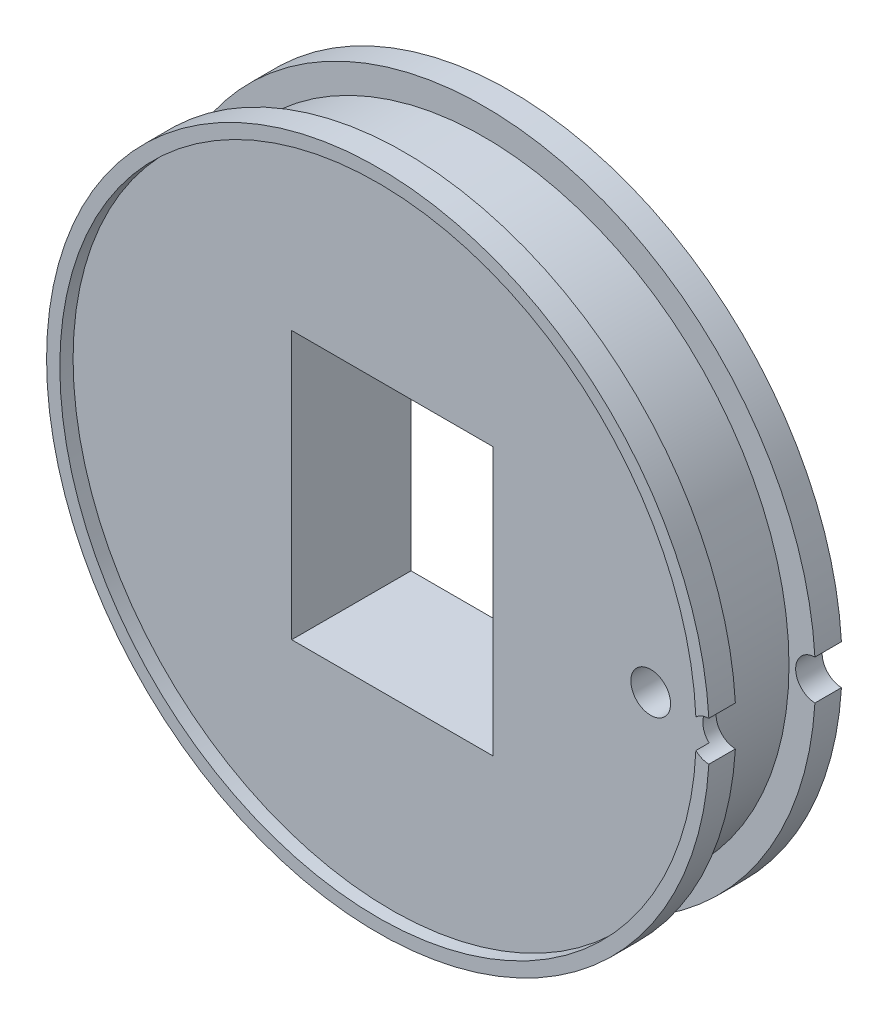
ISO-10303-21;
HEADER;
FILE_DESCRIPTION(('STEP AP214'),'2;1');
FILE_NAME('part.step','',(''),(''),'','','');
FILE_SCHEMA(('AUTOMOTIVE_DESIGN { 1 0 10303 214 1 1 1 1 }'));
ENDSEC;
DATA;
#1=APPLICATION_CONTEXT('core data for automotive mechanical design processes');
#2=APPLICATION_PROTOCOL_DEFINITION('international standard','automotive_design',2000,#1);
#3=PRODUCT_CONTEXT('',#1,'mechanical');
#4=PRODUCT('Part','Part','',(#3));
#5=PRODUCT_RELATED_PRODUCT_CATEGORY('part','',(#4));
#6=PRODUCT_DEFINITION_FORMATION('','',#4);
#7=PRODUCT_DEFINITION_CONTEXT('part definition',#1,'design');
#8=PRODUCT_DEFINITION('design','',#6,#7);
#9=PRODUCT_DEFINITION_SHAPE('','',#8);
#10=(LENGTH_UNIT() NAMED_UNIT(*) SI_UNIT(.MILLI.,.METRE.));
#11=(NAMED_UNIT(*) PLANE_ANGLE_UNIT() SI_UNIT($,.RADIAN.));
#12=(NAMED_UNIT(*) SI_UNIT($,.STERADIAN.) SOLID_ANGLE_UNIT());
#13=UNCERTAINTY_MEASURE_WITH_UNIT(LENGTH_MEASURE(1.E-05),#10,'distance_accuracy_value','');
#14=(GEOMETRIC_REPRESENTATION_CONTEXT(3) GLOBAL_UNCERTAINTY_ASSIGNED_CONTEXT((#13)) GLOBAL_UNIT_ASSIGNED_CONTEXT((#10,
#11,#12)) REPRESENTATION_CONTEXT('',''));
#15=CARTESIAN_POINT('',(0.,0.,0.));
#16=DIRECTION('',(0.,0.,1.));
#17=DIRECTION('',(1.,0.,0.));
#18=AXIS2_PLACEMENT_3D('',#15,#16,#17);
#19=CARTESIAN_POINT('',(0.,0.,9.));
#20=DIRECTION('',(0.,0.,-1.));
#21=DIRECTION('',(-1.,0.,0.));
#22=AXIS2_PLACEMENT_3D('',#19,#20,#21);
#23=CYLINDRICAL_SURFACE('',#22,25.);
#24=CARTESIAN_POINT('',(0.,0.,8.));
#25=DIRECTION('',(0.,0.,-1.));
#26=DIRECTION('',(-1.,0.,0.));
#27=AXIS2_PLACEMENT_3D('',#24,#25,#26);
#28=CIRCLE('',#27,25.);
#29=CARTESIAN_POINT('',(24.955,-1.49932484805663,8.));
#30=VERTEX_POINT('',#29);
#31=CARTESIAN_POINT('',(24.955,1.49932484805663,8.));
#32=VERTEX_POINT('',#31);
#33=EDGE_CURVE('E184',#30,#32,#28,.T.);
#34=ORIENTED_EDGE('',*,*,#33,.F.);
#35=DIRECTION('',(0.,0.,-1.));
#36=VECTOR('',#35,1.);
#37=CARTESIAN_POINT('',(24.955,-1.49932484805662,5.));
#38=LINE('',#37,#36);
#39=CARTESIAN_POINT('',(24.955,-1.49932484805662,10.));
#40=VERTEX_POINT('',#39);
#41=EDGE_CURVE('E58',#30,#40,#38,.F.);
#42=ORIENTED_EDGE('',*,*,#41,.T.);
#43=CARTESIAN_POINT('',(0.,0.,10.));
#44=DIRECTION('',(0.,0.,1.));
#45=DIRECTION('',(1.,0.,0.));
#46=AXIS2_PLACEMENT_3D('',#43,#44,#45);
#47=CIRCLE('',#46,25.);
#48=CARTESIAN_POINT('',(24.955,1.49932484805662,10.));
#49=VERTEX_POINT('',#48);
#50=EDGE_CURVE('E145',#49,#40,#47,.T.);
#51=ORIENTED_EDGE('',*,*,#50,.F.);
#52=DIRECTION('',(0.,0.,-1.));
#53=VECTOR('',#52,1.);
#54=CARTESIAN_POINT('',(24.955,1.49932484805662,5.));
#55=LINE('',#54,#53);
#56=EDGE_CURVE('E123',#49,#32,#55,.T.);
#57=ORIENTED_EDGE('',*,*,#56,.T.);
#58=EDGE_LOOP('',(#34,#42,#51,#57));
#59=FACE_BOUND('',#58,.T.);
#60=ADVANCED_FACE('F42',(#59),#23,.T.);
#61=CARTESIAN_POINT('',(0.,0.,0.));
#62=DIRECTION('',(0.,0.,1.));
#63=DIRECTION('',(1.,0.,0.));
#64=AXIS2_PLACEMENT_3D('',#61,#62,#63);
#65=CIRCLE('',#64,25.);
#66=CARTESIAN_POINT('',(24.955,1.49932484805662,0.));
#67=VERTEX_POINT('',#66);
#68=CARTESIAN_POINT('',(24.955,-1.49932484805662,0.));
#69=VERTEX_POINT('',#68);
#70=EDGE_CURVE('E150',#67,#69,#65,.T.);
#71=ORIENTED_EDGE('',*,*,#70,.T.);
#72=DIRECTION('',(0.,0.,-1.));
#73=VECTOR('',#72,1.);
#74=CARTESIAN_POINT('',(24.955,-1.49932484805662,5.));
#75=LINE('',#74,#73);
#76=CARTESIAN_POINT('',(24.955,-1.49932484805663,2.));
#77=VERTEX_POINT('',#76);
#78=EDGE_CURVE('E256',#69,#77,#75,.F.);
#79=ORIENTED_EDGE('',*,*,#78,.T.);
#80=CARTESIAN_POINT('',(0.,0.,2.));
#81=DIRECTION('',(0.,0.,-1.));
#82=DIRECTION('',(-1.,0.,0.));
#83=AXIS2_PLACEMENT_3D('',#80,#81,#82);
#84=CIRCLE('',#83,25.);
#85=CARTESIAN_POINT('',(24.955,1.49932484805663,2.));
#86=VERTEX_POINT('',#85);
#87=EDGE_CURVE('E182',#77,#86,#84,.T.);
#88=ORIENTED_EDGE('',*,*,#87,.T.);
#89=DIRECTION('',(0.,0.,-1.));
#90=VECTOR('',#89,1.);
#91=CARTESIAN_POINT('',(24.955,1.49932484805662,5.));
#92=LINE('',#91,#90);
#93=EDGE_CURVE('E66',#86,#67,#92,.T.);
#94=ORIENTED_EDGE('',*,*,#93,.T.);
#95=EDGE_LOOP('',(#71,#79,#88,#94));
#96=FACE_BOUND('',#95,.T.);
#97=ADVANCED_FACE('F44',(#96),#23,.T.);
#98=CARTESIAN_POINT('',(0.,0.,0.));
#99=DIRECTION('',(0.,0.,1.));
#100=DIRECTION('',(1.,0.,0.));
#101=AXIS2_PLACEMENT_3D('',#98,#99,#100);
#102=PLANE('',#101);
#103=CARTESIAN_POINT('',(19.5694728285183,0.,0.));
#104=DIRECTION('',(0.,0.,-1.));
#105=DIRECTION('',(-1.,0.,0.));
#106=AXIS2_PLACEMENT_3D('',#103,#104,#105);
#107=CIRCLE('',#106,1.5);
#108=CARTESIAN_POINT('',(18.0694728285183,0.,0.));
#109=VERTEX_POINT('',#108);
#110=EDGE_CURVE('E165',#109,#109,#107,.T.);
#111=ORIENTED_EDGE('',*,*,#110,.F.);
#112=EDGE_LOOP('',(#111));
#113=FACE_BOUND('',#112,.T.);
#114=DIRECTION('',(1.,0.,0.));
#115=VECTOR('',#114,1.);
#116=CARTESIAN_POINT('',(-7.51,10.1,0.));
#117=LINE('',#116,#115);
#118=CARTESIAN_POINT('',(-7.51,10.1,0.));
#119=VERTEX_POINT('',#118);
#120=CARTESIAN_POINT('',(7.69,10.1,0.));
#121=VERTEX_POINT('',#120);
#122=EDGE_CURVE('E194',#119,#121,#117,.T.);
#123=ORIENTED_EDGE('',*,*,#122,.F.);
#124=DIRECTION('',(0.,1.,0.));
#125=VECTOR('',#124,1.);
#126=CARTESIAN_POINT('',(-7.51,10.1,0.));
#127=LINE('',#126,#125);
#128=CARTESIAN_POINT('',(-7.51,-10.1,0.));
#129=VERTEX_POINT('',#128);
#130=EDGE_CURVE('E198',#129,#119,#127,.T.);
#131=ORIENTED_EDGE('',*,*,#130,.F.);
#132=DIRECTION('',(-1.,0.,0.));
#133=VECTOR('',#132,1.);
#134=CARTESIAN_POINT('',(-7.51,-10.1,0.));
#135=LINE('',#134,#133);
#136=CARTESIAN_POINT('',(7.69,-10.1,0.));
#137=VERTEX_POINT('',#136);
#138=EDGE_CURVE('E146',#137,#129,#135,.T.);
#139=ORIENTED_EDGE('',*,*,#138,.F.);
#140=DIRECTION('',(0.,-1.,0.));
#141=VECTOR('',#140,1.);
#142=CARTESIAN_POINT('',(7.69,10.1,0.));
#143=LINE('',#142,#141);
#144=EDGE_CURVE('E188',#121,#137,#143,.T.);
#145=ORIENTED_EDGE('',*,*,#144,.F.);
#146=EDGE_LOOP('',(#123,#131,#139,#145));
#147=FACE_BOUND('',#146,.T.);
#148=ORIENTED_EDGE('',*,*,#70,.F.);
#149=CARTESIAN_POINT('',(25.,0.,0.));
#150=DIRECTION('',(0.,0.,-1.));
#151=DIRECTION('',(-1.,0.,0.));
#152=AXIS2_PLACEMENT_3D('',#149,#150,#151);
#153=CIRCLE('',#152,1.5);
#154=EDGE_CURVE('E253',#69,#67,#153,.T.);
#155=ORIENTED_EDGE('',*,*,#154,.F.);
#156=EDGE_LOOP('',(#148,#155));
#157=FACE_BOUND('',#156,.T.);
#158=ADVANCED_FACE('F247',(#113,#147,#157),#102,.F.);
#159=CARTESIAN_POINT('',(0.,0.,10.));
#160=DIRECTION('',(0.,0.,1.));
#161=DIRECTION('',(1.,0.,0.));
#162=AXIS2_PLACEMENT_3D('',#159,#160,#161);
#163=PLANE('',#162);
#164=CARTESIAN_POINT('',(25.,0.,10.));
#165=DIRECTION('',(0.,0.,-1.));
#166=DIRECTION('',(-1.,0.,0.));
#167=AXIS2_PLACEMENT_3D('',#164,#165,#166);
#168=CIRCLE('',#167,1.5);
#169=CARTESIAN_POINT('',(23.975,1.09515980569048,10.));
#170=VERTEX_POINT('',#169);
#171=EDGE_CURVE('E117',#170,#49,#168,.T.);
#172=ORIENTED_EDGE('',*,*,#171,.T.);
#173=ORIENTED_EDGE('',*,*,#50,.T.);
#174=CARTESIAN_POINT('',(23.975,-1.09515980569048,10.));
#175=VERTEX_POINT('',#174);
#176=EDGE_CURVE('E129',#40,#175,#168,.T.);
#177=ORIENTED_EDGE('',*,*,#176,.T.);
#178=CARTESIAN_POINT('',(0.,0.,10.));
#179=DIRECTION('',(0.,0.,1.));
#180=DIRECTION('',(1.,0.,0.));
#181=AXIS2_PLACEMENT_3D('',#178,#179,#180);
#182=CIRCLE('',#181,24.);
#183=EDGE_CURVE('E136',#170,#175,#182,.T.);
#184=ORIENTED_EDGE('',*,*,#183,.F.);
#185=EDGE_LOOP('',(#172,#173,#177,#184));
#186=FACE_BOUND('',#185,.T.);
#187=ADVANCED_FACE('F143',(#186),#163,.T.);
#188=CARTESIAN_POINT('',(0.,0.,10.));
#189=DIRECTION('',(0.,0.,-1.));
#190=DIRECTION('',(-1.,0.,0.));
#191=AXIS2_PLACEMENT_3D('',#188,#189,#190);
#192=CYLINDRICAL_SURFACE('',#191,24.);
#193=DIRECTION('',(0.,0.,-1.));
#194=VECTOR('',#193,1.);
#195=CARTESIAN_POINT('',(23.975,-1.09515980569048,5.));
#196=LINE('',#195,#194);
#197=CARTESIAN_POINT('',(23.975,-1.09515980569049,9.));
#198=VERTEX_POINT('',#197);
#199=EDGE_CURVE('E139',#198,#175,#196,.F.);
#200=ORIENTED_EDGE('',*,*,#199,.F.);
#201=CARTESIAN_POINT('',(0.,0.,9.));
#202=DIRECTION('',(0.,0.,1.));
#203=DIRECTION('',(1.,0.,0.));
#204=AXIS2_PLACEMENT_3D('',#201,#202,#203);
#205=CIRCLE('',#204,24.);
#206=CARTESIAN_POINT('',(23.975,1.09515980569049,9.));
#207=VERTEX_POINT('',#206);
#208=EDGE_CURVE('E51',#198,#207,#205,.F.);
#209=ORIENTED_EDGE('',*,*,#208,.T.);
#210=DIRECTION('',(0.,0.,-1.));
#211=VECTOR('',#210,1.);
#212=CARTESIAN_POINT('',(23.975,1.09515980569048,5.));
#213=LINE('',#212,#211);
#214=EDGE_CURVE('E120',#170,#207,#213,.T.);
#215=ORIENTED_EDGE('',*,*,#214,.F.);
#216=ORIENTED_EDGE('',*,*,#183,.T.);
#217=EDGE_LOOP('',(#200,#209,#215,#216));
#218=FACE_BOUND('',#217,.T.);
#219=ADVANCED_FACE('F135',(#218),#192,.F.);
#220=CARTESIAN_POINT('',(0.,0.,9.));
#221=DIRECTION('',(0.,0.,1.));
#222=DIRECTION('',(1.,0.,0.));
#223=AXIS2_PLACEMENT_3D('',#220,#221,#222);
#224=PLANE('',#223);
#225=CARTESIAN_POINT('',(25.,0.,9.));
#226=DIRECTION('',(0.,0.,1.));
#227=DIRECTION('',(1.,0.,0.));
#228=AXIS2_PLACEMENT_3D('',#225,#226,#227);
#229=CIRCLE('',#228,1.5);
#230=EDGE_CURVE('E140',#207,#198,#229,.T.);
#231=ORIENTED_EDGE('',*,*,#230,.F.);
#232=ORIENTED_EDGE('',*,*,#208,.F.);
#233=EDGE_LOOP('',(#231,#232));
#234=FACE_BOUND('',#233,.T.);
#235=CARTESIAN_POINT('',(19.5694728285183,0.,9.));
#236=DIRECTION('',(0.,0.,1.));
#237=DIRECTION('',(1.,0.,0.));
#238=AXIS2_PLACEMENT_3D('',#235,#236,#237);
#239=CIRCLE('',#238,1.5);
#240=CARTESIAN_POINT('',(21.0694728285183,0.,9.));
#241=VERTEX_POINT('',#240);
#242=EDGE_CURVE('E161',#241,#241,#239,.T.);
#243=ORIENTED_EDGE('',*,*,#242,.F.);
#244=EDGE_LOOP('',(#243));
#245=FACE_BOUND('',#244,.T.);
#246=DIRECTION('',(0.,-1.,0.));
#247=VECTOR('',#246,1.);
#248=CARTESIAN_POINT('',(-7.51,10.1,9.));
#249=LINE('',#248,#247);
#250=CARTESIAN_POINT('',(-7.51,10.1,9.));
#251=VERTEX_POINT('',#250);
#252=CARTESIAN_POINT('',(-7.51,-10.1,9.));
#253=VERTEX_POINT('',#252);
#254=EDGE_CURVE('E202',#251,#253,#249,.T.);
#255=ORIENTED_EDGE('',*,*,#254,.F.);
#256=DIRECTION('',(-1.,0.,0.));
#257=VECTOR('',#256,1.);
#258=CARTESIAN_POINT('',(-7.51,10.1,9.));
#259=LINE('',#258,#257);
#260=CARTESIAN_POINT('',(7.69,10.1,9.));
#261=VERTEX_POINT('',#260);
#262=EDGE_CURVE('E213',#261,#251,#259,.T.);
#263=ORIENTED_EDGE('',*,*,#262,.F.);
#264=DIRECTION('',(0.,1.,0.));
#265=VECTOR('',#264,1.);
#266=CARTESIAN_POINT('',(7.69,10.1,9.));
#267=LINE('',#266,#265);
#268=CARTESIAN_POINT('',(7.69,-10.1,9.));
#269=VERTEX_POINT('',#268);
#270=EDGE_CURVE('E210',#269,#261,#267,.T.);
#271=ORIENTED_EDGE('',*,*,#270,.F.);
#272=DIRECTION('',(1.,0.,0.));
#273=VECTOR('',#272,1.);
#274=CARTESIAN_POINT('',(-7.51,-10.1,9.));
#275=LINE('',#274,#273);
#276=EDGE_CURVE('E206',#253,#269,#275,.T.);
#277=ORIENTED_EDGE('',*,*,#276,.F.);
#278=EDGE_LOOP('',(#255,#263,#271,#277));
#279=FACE_BOUND('',#278,.T.);
#280=ADVANCED_FACE('F239',(#234,#245,#279),#224,.T.);
#281=CARTESIAN_POINT('',(-7.51,10.1,-0.000999999999999265));
#282=DIRECTION('',(-1.,0.,0.));
#283=DIRECTION('',(0.,-1.,0.));
#284=AXIS2_PLACEMENT_3D('',#281,#282,#283);
#285=PLANE('',#284);
#286=ORIENTED_EDGE('',*,*,#130,.T.);
#287=DIRECTION('',(0.,0.,1.));
#288=VECTOR('',#287,1.);
#289=CARTESIAN_POINT('',(-7.51,10.1,-0.000999999999999265));
#290=LINE('',#289,#288);
#291=EDGE_CURVE('E153',#119,#251,#290,.T.);
#292=ORIENTED_EDGE('',*,*,#291,.T.);
#293=ORIENTED_EDGE('',*,*,#254,.T.);
#294=DIRECTION('',(0.,0.,1.));
#295=VECTOR('',#294,1.);
#296=CARTESIAN_POINT('',(-7.51,-10.1,-0.000999999999999265));
#297=LINE('',#296,#295);
#298=EDGE_CURVE('E217',#129,#253,#297,.T.);
#299=ORIENTED_EDGE('',*,*,#298,.F.);
#300=EDGE_LOOP('',(#286,#292,#293,#299));
#301=FACE_BOUND('',#300,.T.);
#302=ADVANCED_FACE('F236',(#301),#285,.F.);
#303=CARTESIAN_POINT('',(-7.51,10.1,-0.000999999999999265));
#304=DIRECTION('',(0.,1.,0.));
#305=DIRECTION('',(0.,0.,1.));
#306=AXIS2_PLACEMENT_3D('',#303,#304,#305);
#307=PLANE('',#306);
#308=ORIENTED_EDGE('',*,*,#122,.T.);
#309=DIRECTION('',(0.,0.,1.));
#310=VECTOR('',#309,1.);
#311=CARTESIAN_POINT('',(7.69,10.1,-0.000999999999999265));
#312=LINE('',#311,#310);
#313=EDGE_CURVE('E220',#121,#261,#312,.T.);
#314=ORIENTED_EDGE('',*,*,#313,.T.);
#315=ORIENTED_EDGE('',*,*,#262,.T.);
#316=ORIENTED_EDGE('',*,*,#291,.F.);
#317=EDGE_LOOP('',(#308,#314,#315,#316));
#318=FACE_BOUND('',#317,.T.);
#319=ADVANCED_FACE('F243',(#318),#307,.F.);
#320=CARTESIAN_POINT('',(7.69,10.1,-0.000999999999999265));
#321=DIRECTION('',(1.,0.,0.));
#322=DIRECTION('',(0.,1.,0.));
#323=AXIS2_PLACEMENT_3D('',#320,#321,#322);
#324=PLANE('',#323);
#325=ORIENTED_EDGE('',*,*,#144,.T.);
#326=DIRECTION('',(0.,0.,1.));
#327=VECTOR('',#326,1.);
#328=CARTESIAN_POINT('',(7.69,-10.1,-0.000999999999999265));
#329=LINE('',#328,#327);
#330=EDGE_CURVE('E224',#137,#269,#329,.T.);
#331=ORIENTED_EDGE('',*,*,#330,.T.);
#332=ORIENTED_EDGE('',*,*,#270,.T.);
#333=ORIENTED_EDGE('',*,*,#313,.F.);
#334=EDGE_LOOP('',(#325,#331,#332,#333));
#335=FACE_BOUND('',#334,.T.);
#336=ADVANCED_FACE('F241',(#335),#324,.F.);
#337=CARTESIAN_POINT('',(-7.51,-10.1,-0.000999999999999265));
#338=DIRECTION('',(0.,-1.,0.));
#339=DIRECTION('',(1.,0.,0.));
#340=AXIS2_PLACEMENT_3D('',#337,#338,#339);
#341=PLANE('',#340);
#342=ORIENTED_EDGE('',*,*,#138,.T.);
#343=ORIENTED_EDGE('',*,*,#298,.T.);
#344=ORIENTED_EDGE('',*,*,#276,.T.);
#345=ORIENTED_EDGE('',*,*,#330,.F.);
#346=EDGE_LOOP('',(#342,#343,#344,#345));
#347=FACE_BOUND('',#346,.T.);
#348=ADVANCED_FACE('F228',(#347),#341,.F.);
#349=CARTESIAN_POINT('',(0.,0.,8.));
#350=DIRECTION('',(0.,0.,-1.));
#351=DIRECTION('',(-1.,0.,0.));
#352=AXIS2_PLACEMENT_3D('',#349,#350,#351);
#353=PLANE('',#352);
#354=CARTESIAN_POINT('',(25.,0.,8.));
#355=DIRECTION('',(0.,0.,-1.));
#356=DIRECTION('',(-1.,0.,0.));
#357=AXIS2_PLACEMENT_3D('',#354,#355,#356);
#358=CIRCLE('',#357,1.5);
#359=EDGE_CURVE('E261',#30,#32,#358,.T.);
#360=ORIENTED_EDGE('',*,*,#359,.F.);
#361=ORIENTED_EDGE('',*,*,#33,.T.);
#362=EDGE_LOOP('',(#360,#361));
#363=FACE_BOUND('',#362,.T.);
#364=CARTESIAN_POINT('',(0.,0.,8.));
#365=DIRECTION('',(0.,0.,-1.));
#366=DIRECTION('',(-1.,0.,0.));
#367=AXIS2_PLACEMENT_3D('',#364,#365,#366);
#368=CIRCLE('',#367,23.);
#369=CARTESIAN_POINT('',(-23.,0.,8.));
#370=VERTEX_POINT('',#369);
#371=EDGE_CURVE('E171',#370,#370,#368,.T.);
#372=ORIENTED_EDGE('',*,*,#371,.F.);
#373=EDGE_LOOP('',(#372));
#374=FACE_BOUND('',#373,.T.);
#375=ADVANCED_FACE('F290',(#363,#374),#353,.T.);
#376=CARTESIAN_POINT('',(0.,0.,2.));
#377=DIRECTION('',(0.,0.,-1.));
#378=DIRECTION('',(-1.,0.,0.));
#379=AXIS2_PLACEMENT_3D('',#376,#377,#378);
#380=PLANE('',#379);
#381=CARTESIAN_POINT('',(0.,0.,2.));
#382=DIRECTION('',(0.,0.,-1.));
#383=DIRECTION('',(-1.,0.,0.));
#384=AXIS2_PLACEMENT_3D('',#381,#382,#383);
#385=CIRCLE('',#384,23.);
#386=CARTESIAN_POINT('',(-23.,0.,2.));
#387=VERTEX_POINT('',#386);
#388=EDGE_CURVE('E164',#387,#387,#385,.T.);
#389=ORIENTED_EDGE('',*,*,#388,.T.);
#390=EDGE_LOOP('',(#389));
#391=FACE_BOUND('',#390,.T.);
#392=ORIENTED_EDGE('',*,*,#87,.F.);
#393=CARTESIAN_POINT('',(25.,0.,2.));
#394=DIRECTION('',(0.,0.,-1.));
#395=DIRECTION('',(-1.,0.,0.));
#396=AXIS2_PLACEMENT_3D('',#393,#394,#395);
#397=CIRCLE('',#396,1.5);
#398=EDGE_CURVE('E11',#77,#86,#397,.T.);
#399=ORIENTED_EDGE('',*,*,#398,.T.);
#400=EDGE_LOOP('',(#392,#399));
#401=FACE_BOUND('',#400,.T.);
#402=ADVANCED_FACE('F293',(#391,#401),#380,.F.);
#403=CARTESIAN_POINT('',(0.,0.,8.));
#404=DIRECTION('',(0.,0.,-1.));
#405=DIRECTION('',(-1.,0.,0.));
#406=AXIS2_PLACEMENT_3D('',#403,#404,#405);
#407=CYLINDRICAL_SURFACE('',#406,23.);
#408=ORIENTED_EDGE('',*,*,#371,.T.);
#409=EDGE_LOOP('',(#408));
#410=FACE_BOUND('',#409,.T.);
#411=ORIENTED_EDGE('',*,*,#388,.F.);
#412=EDGE_LOOP('',(#411));
#413=FACE_BOUND('',#412,.T.);
#414=ADVANCED_FACE('F297',(#410,#413),#407,.T.);
#415=CARTESIAN_POINT('',(19.5694728285183,0.,10.));
#416=DIRECTION('',(0.,0.,-1.));
#417=DIRECTION('',(-1.,0.,0.));
#418=AXIS2_PLACEMENT_3D('',#415,#416,#417);
#419=CYLINDRICAL_SURFACE('',#418,1.5);
#420=ORIENTED_EDGE('',*,*,#242,.T.);
#421=EDGE_LOOP('',(#420));
#422=FACE_BOUND('',#421,.T.);
#423=ORIENTED_EDGE('',*,*,#110,.T.);
#424=EDGE_LOOP('',(#423));
#425=FACE_BOUND('',#424,.T.);
#426=ADVANCED_FACE('F300',(#422,#425),#419,.F.);
#427=CARTESIAN_POINT('',(25.,0.,10.));
#428=DIRECTION('',(0.,0.,-1.));
#429=DIRECTION('',(-1.,0.,0.));
#430=AXIS2_PLACEMENT_3D('',#427,#428,#429);
#431=CYLINDRICAL_SURFACE('',#430,1.5);
#432=ORIENTED_EDGE('',*,*,#154,.T.);
#433=ORIENTED_EDGE('',*,*,#93,.F.);
#434=ORIENTED_EDGE('',*,*,#398,.F.);
#435=ORIENTED_EDGE('',*,*,#78,.F.);
#436=EDGE_LOOP('',(#432,#433,#434,#435));
#437=FACE_BOUND('',#436,.T.);
#438=ADVANCED_FACE('F307',(#437),#431,.F.);
#439=ORIENTED_EDGE('',*,*,#199,.T.);
#440=ORIENTED_EDGE('',*,*,#176,.F.);
#441=ORIENTED_EDGE('',*,*,#41,.F.);
#442=ORIENTED_EDGE('',*,*,#359,.T.);
#443=ORIENTED_EDGE('',*,*,#56,.F.);
#444=ORIENTED_EDGE('',*,*,#171,.F.);
#445=ORIENTED_EDGE('',*,*,#214,.T.);
#446=ORIENTED_EDGE('',*,*,#230,.T.);
#447=EDGE_LOOP('',(#439,#440,#441,#442,#443,#444,#445,#446));
#448=FACE_BOUND('',#447,.T.);
#449=ADVANCED_FACE('F119',(#448),#431,.F.);
#450=CLOSED_SHELL('',(#60,#97,#158,#187,#219,#280,#302,#319,#336,#348,#375,#402,#414,#426,#438,#449));
#451=MANIFOLD_SOLID_BREP('B2',#450);
#452=ADVANCED_BREP_SHAPE_REPRESENTATION('',(#18,#451),#14);
#453=SHAPE_DEFINITION_REPRESENTATION(#9,#452);
ENDSEC;
END-ISO-10303-21;
